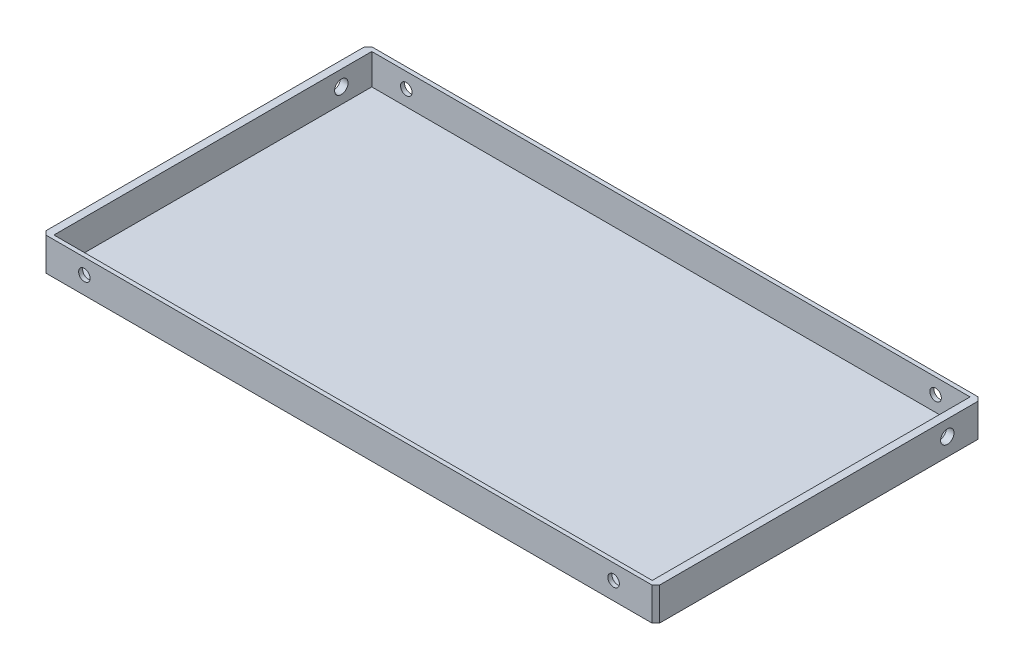
ISO-10303-21;
HEADER;
FILE_DESCRIPTION(('STEP AP214'),'2;1');
FILE_NAME('part.step','',(''),(''),'','','');
FILE_SCHEMA(('AUTOMOTIVE_DESIGN { 1 0 10303 214 1 1 1 1 }'));
ENDSEC;
DATA;
#1=APPLICATION_CONTEXT('core data for automotive mechanical design processes');
#2=APPLICATION_PROTOCOL_DEFINITION('international standard','automotive_design',2000,#1);
#3=PRODUCT_CONTEXT('',#1,'mechanical');
#4=PRODUCT('Part','Part','',(#3));
#5=PRODUCT_RELATED_PRODUCT_CATEGORY('part','',(#4));
#6=PRODUCT_DEFINITION_FORMATION('','',#4);
#7=PRODUCT_DEFINITION_CONTEXT('part definition',#1,'design');
#8=PRODUCT_DEFINITION('design','',#6,#7);
#9=PRODUCT_DEFINITION_SHAPE('','',#8);
#10=(LENGTH_UNIT() NAMED_UNIT(*) SI_UNIT(.MILLI.,.METRE.));
#11=(NAMED_UNIT(*) PLANE_ANGLE_UNIT() SI_UNIT($,.RADIAN.));
#12=(NAMED_UNIT(*) SI_UNIT($,.STERADIAN.) SOLID_ANGLE_UNIT());
#13=UNCERTAINTY_MEASURE_WITH_UNIT(LENGTH_MEASURE(1.E-05),#10,'distance_accuracy_value','');
#14=(GEOMETRIC_REPRESENTATION_CONTEXT(3) GLOBAL_UNCERTAINTY_ASSIGNED_CONTEXT((#13)) GLOBAL_UNIT_ASSIGNED_CONTEXT((#10,
#11,#12)) REPRESENTATION_CONTEXT('',''));
#15=CARTESIAN_POINT('',(0.,0.,0.));
#16=DIRECTION('',(0.,0.,1.));
#17=DIRECTION('',(1.,0.,0.));
#18=AXIS2_PLACEMENT_3D('',#15,#16,#17);
#19=CARTESIAN_POINT('',(80.,0.6,-42.5));
#20=DIRECTION('',(-1.,0.,0.));
#21=DIRECTION('',(0.,0.,1.));
#22=AXIS2_PLACEMENT_3D('',#19,#20,#21);
#23=PLANE('',#22);
#24=CARTESIAN_POINT('',(80.,4.6,-33.5));
#25=DIRECTION('',(1.,0.,0.));
#26=DIRECTION('',(0.,0.,-1.));
#27=AXIS2_PLACEMENT_3D('',#24,#25,#26);
#28=CIRCLE('',#27,1.75);
#29=CARTESIAN_POINT('',(80.,4.6,-35.25));
#30=VERTEX_POINT('',#29);
#31=EDGE_CURVE('E348',#30,#30,#28,.T.);
#32=ORIENTED_EDGE('',*,*,#31,.F.);
#33=EDGE_LOOP('',(#32));
#34=FACE_BOUND('',#33,.T.);
#35=DIRECTION('',(0.,0.,-1.));
#36=VECTOR('',#35,1.);
#37=CARTESIAN_POINT('',(80.,0.,-42.5));
#38=LINE('',#37,#36);
#39=CARTESIAN_POINT('',(80.,0.,41.5));
#40=VERTEX_POINT('',#39);
#41=CARTESIAN_POINT('',(80.,0.,-41.5));
#42=VERTEX_POINT('',#41);
#43=EDGE_CURVE('E178',#40,#42,#38,.T.);
#44=ORIENTED_EDGE('',*,*,#43,.T.);
#45=DIRECTION('',(0.,1.,0.));
#46=VECTOR('',#45,1.);
#47=CARTESIAN_POINT('',(80.,0.6,-41.5));
#48=LINE('',#47,#46);
#49=CARTESIAN_POINT('',(80.,8.6,-41.5));
#50=VERTEX_POINT('',#49);
#51=EDGE_CURVE('E205',#42,#50,#48,.T.);
#52=ORIENTED_EDGE('',*,*,#51,.T.);
#53=DIRECTION('',(0.,0.,-1.));
#54=VECTOR('',#53,1.);
#55=CARTESIAN_POINT('',(80.,8.6,42.5));
#56=LINE('',#55,#54);
#57=CARTESIAN_POINT('',(80.,8.6,41.5));
#58=VERTEX_POINT('',#57);
#59=EDGE_CURVE('E144',#58,#50,#56,.T.);
#60=ORIENTED_EDGE('',*,*,#59,.F.);
#61=DIRECTION('',(0.,-1.,0.));
#62=VECTOR('',#61,1.);
#63=CARTESIAN_POINT('',(80.,0.6,41.5));
#64=LINE('',#63,#62);
#65=EDGE_CURVE('E202',#58,#40,#64,.T.);
#66=ORIENTED_EDGE('',*,*,#65,.T.);
#67=EDGE_LOOP('',(#44,#52,#60,#66));
#68=FACE_BOUND('',#67,.T.);
#69=ADVANCED_FACE('F33',(#34,#68),#23,.F.);
#70=CARTESIAN_POINT('',(-80.,0.6,-42.5));
#71=DIRECTION('',(0.,0.,1.));
#72=DIRECTION('',(1.,0.,0.));
#73=AXIS2_PLACEMENT_3D('',#70,#71,#72);
#74=PLANE('',#73);
#75=CARTESIAN_POINT('',(69.,4.6,-42.5));
#76=DIRECTION('',(0.,0.,1.));
#77=DIRECTION('',(1.,0.,0.));
#78=AXIS2_PLACEMENT_3D('',#75,#76,#77);
#79=CIRCLE('',#78,1.5);
#80=CARTESIAN_POINT('',(70.5,4.6,-42.5));
#81=VERTEX_POINT('',#80);
#82=EDGE_CURVE('E232',#81,#81,#79,.T.);
#83=ORIENTED_EDGE('',*,*,#82,.T.);
#84=EDGE_LOOP('',(#83));
#85=FACE_BOUND('',#84,.T.);
#86=CARTESIAN_POINT('',(-69.0000000000001,4.6,-42.5));
#87=DIRECTION('',(0.,0.,1.));
#88=DIRECTION('',(1.,0.,0.));
#89=AXIS2_PLACEMENT_3D('',#86,#87,#88);
#90=CIRCLE('',#89,1.5);
#91=CARTESIAN_POINT('',(-67.5000000000001,4.6,-42.5));
#92=VERTEX_POINT('',#91);
#93=EDGE_CURVE('E159',#92,#92,#90,.T.);
#94=ORIENTED_EDGE('',*,*,#93,.T.);
#95=EDGE_LOOP('',(#94));
#96=FACE_BOUND('',#95,.T.);
#97=DIRECTION('',(-1.,0.,0.));
#98=VECTOR('',#97,1.);
#99=CARTESIAN_POINT('',(-80.,8.6,-42.5));
#100=LINE('',#99,#98);
#101=CARTESIAN_POINT('',(79.,8.6,-42.5));
#102=VERTEX_POINT('',#101);
#103=CARTESIAN_POINT('',(-79.,8.6,-42.5));
#104=VERTEX_POINT('',#103);
#105=EDGE_CURVE('E171',#102,#104,#100,.T.);
#106=ORIENTED_EDGE('',*,*,#105,.F.);
#107=DIRECTION('',(0.,-1.,0.));
#108=VECTOR('',#107,1.);
#109=CARTESIAN_POINT('',(79.,0.6,-42.5));
#110=LINE('',#109,#108);
#111=CARTESIAN_POINT('',(79.,0.,-42.5));
#112=VERTEX_POINT('',#111);
#113=EDGE_CURVE('E191',#102,#112,#110,.T.);
#114=ORIENTED_EDGE('',*,*,#113,.T.);
#115=DIRECTION('',(-1.,0.,0.));
#116=VECTOR('',#115,1.);
#117=CARTESIAN_POINT('',(-80.,0.,-42.5));
#118=LINE('',#117,#116);
#119=CARTESIAN_POINT('',(-79.,0.,-42.5));
#120=VERTEX_POINT('',#119);
#121=EDGE_CURVE('E181',#112,#120,#118,.T.);
#122=ORIENTED_EDGE('',*,*,#121,.T.);
#123=DIRECTION('',(0.,1.,0.));
#124=VECTOR('',#123,1.);
#125=CARTESIAN_POINT('',(-79.,0.6,-42.5));
#126=LINE('',#125,#124);
#127=EDGE_CURVE('E189',#120,#104,#126,.T.);
#128=ORIENTED_EDGE('',*,*,#127,.T.);
#129=EDGE_LOOP('',(#106,#114,#122,#128));
#130=FACE_BOUND('',#129,.T.);
#131=ADVANCED_FACE('F252',(#85,#96,#130),#74,.F.);
#132=CARTESIAN_POINT('',(-80.,0.6,-42.5));
#133=DIRECTION('',(1.,0.,0.));
#134=DIRECTION('',(0.,0.,-1.));
#135=AXIS2_PLACEMENT_3D('',#132,#133,#134);
#136=PLANE('',#135);
#137=CARTESIAN_POINT('',(-80.0000000000001,4.6,-33.5));
#138=DIRECTION('',(1.,0.,0.));
#139=DIRECTION('',(0.,0.,-1.));
#140=AXIS2_PLACEMENT_3D('',#137,#138,#139);
#141=CIRCLE('',#140,1.75);
#142=CARTESIAN_POINT('',(-80.0000000000001,4.6,-35.25));
#143=VERTEX_POINT('',#142);
#144=EDGE_CURVE('E235',#143,#143,#141,.T.);
#145=ORIENTED_EDGE('',*,*,#144,.T.);
#146=EDGE_LOOP('',(#145));
#147=FACE_BOUND('',#146,.T.);
#148=DIRECTION('',(0.,0.,1.));
#149=VECTOR('',#148,1.);
#150=CARTESIAN_POINT('',(-80.,8.6,42.5));
#151=LINE('',#150,#149);
#152=CARTESIAN_POINT('',(-80.,8.6,-41.5));
#153=VERTEX_POINT('',#152);
#154=CARTESIAN_POINT('',(-80.,8.6,41.5));
#155=VERTEX_POINT('',#154);
#156=EDGE_CURVE('E174',#153,#155,#151,.T.);
#157=ORIENTED_EDGE('',*,*,#156,.F.);
#158=DIRECTION('',(0.,-1.,0.));
#159=VECTOR('',#158,1.);
#160=CARTESIAN_POINT('',(-80.,0.6,-41.5));
#161=LINE('',#160,#159);
#162=CARTESIAN_POINT('',(-80.,0.,-41.5));
#163=VERTEX_POINT('',#162);
#164=EDGE_CURVE('E216',#153,#163,#161,.T.);
#165=ORIENTED_EDGE('',*,*,#164,.T.);
#166=DIRECTION('',(0.,0.,1.));
#167=VECTOR('',#166,1.);
#168=CARTESIAN_POINT('',(-80.,0.,-42.5));
#169=LINE('',#168,#167);
#170=CARTESIAN_POINT('',(-80.,0.,41.5));
#171=VERTEX_POINT('',#170);
#172=EDGE_CURVE('E184',#163,#171,#169,.T.);
#173=ORIENTED_EDGE('',*,*,#172,.T.);
#174=DIRECTION('',(0.,1.,0.));
#175=VECTOR('',#174,1.);
#176=CARTESIAN_POINT('',(-80.,0.6,41.5));
#177=LINE('',#176,#175);
#178=EDGE_CURVE('E214',#171,#155,#177,.T.);
#179=ORIENTED_EDGE('',*,*,#178,.T.);
#180=EDGE_LOOP('',(#157,#165,#173,#179));
#181=FACE_BOUND('',#180,.T.);
#182=ADVANCED_FACE('F275',(#147,#181),#136,.F.);
#183=CARTESIAN_POINT('',(-80.,0.6,42.5));
#184=DIRECTION('',(0.,0.,-1.));
#185=DIRECTION('',(-1.,0.,0.));
#186=AXIS2_PLACEMENT_3D('',#183,#184,#185);
#187=PLANE('',#186);
#188=CARTESIAN_POINT('',(69.,4.6,42.5));
#189=DIRECTION('',(0.,0.,1.));
#190=DIRECTION('',(1.,0.,0.));
#191=AXIS2_PLACEMENT_3D('',#188,#189,#190);
#192=CIRCLE('',#191,1.5);
#193=CARTESIAN_POINT('',(70.5,4.6,42.5));
#194=VERTEX_POINT('',#193);
#195=EDGE_CURVE('E228',#194,#194,#192,.T.);
#196=ORIENTED_EDGE('',*,*,#195,.F.);
#197=EDGE_LOOP('',(#196));
#198=FACE_BOUND('',#197,.T.);
#199=CARTESIAN_POINT('',(-69.0000000000001,4.6,42.5));
#200=DIRECTION('',(0.,0.,1.));
#201=DIRECTION('',(1.,0.,0.));
#202=AXIS2_PLACEMENT_3D('',#199,#200,#201);
#203=CIRCLE('',#202,1.5);
#204=CARTESIAN_POINT('',(-67.5000000000001,4.6,42.5));
#205=VERTEX_POINT('',#204);
#206=EDGE_CURVE('E224',#205,#205,#203,.T.);
#207=ORIENTED_EDGE('',*,*,#206,.F.);
#208=EDGE_LOOP('',(#207));
#209=FACE_BOUND('',#208,.T.);
#210=DIRECTION('',(1.,0.,0.));
#211=VECTOR('',#210,1.);
#212=CARTESIAN_POINT('',(-80.,0.,42.5));
#213=LINE('',#212,#211);
#214=CARTESIAN_POINT('',(-79.0000000000001,0.,42.5));
#215=VERTEX_POINT('',#214);
#216=CARTESIAN_POINT('',(79.,0.,42.5));
#217=VERTEX_POINT('',#216);
#218=EDGE_CURVE('E187',#215,#217,#213,.T.);
#219=ORIENTED_EDGE('',*,*,#218,.T.);
#220=DIRECTION('',(0.,1.,0.));
#221=VECTOR('',#220,1.);
#222=CARTESIAN_POINT('',(79.,0.6,42.5));
#223=LINE('',#222,#221);
#224=CARTESIAN_POINT('',(79.,8.6,42.5));
#225=VERTEX_POINT('',#224);
#226=EDGE_CURVE('E11',#217,#225,#223,.T.);
#227=ORIENTED_EDGE('',*,*,#226,.T.);
#228=DIRECTION('',(1.,0.,0.));
#229=VECTOR('',#228,1.);
#230=CARTESIAN_POINT('',(-80.,8.6,42.5));
#231=LINE('',#230,#229);
#232=CARTESIAN_POINT('',(-79.0000000000001,8.6,42.5));
#233=VERTEX_POINT('',#232);
#234=EDGE_CURVE('E176',#233,#225,#231,.T.);
#235=ORIENTED_EDGE('',*,*,#234,.F.);
#236=DIRECTION('',(0.,-1.,0.));
#237=VECTOR('',#236,1.);
#238=CARTESIAN_POINT('',(-79.0000000000001,0.6,42.5));
#239=LINE('',#238,#237);
#240=EDGE_CURVE('E42',#233,#215,#239,.T.);
#241=ORIENTED_EDGE('',*,*,#240,.T.);
#242=EDGE_LOOP('',(#219,#227,#235,#241));
#243=FACE_BOUND('',#242,.T.);
#244=ADVANCED_FACE('F315',(#198,#209,#243),#187,.F.);
#245=CARTESIAN_POINT('',(0.,0.,0.));
#246=DIRECTION('',(0.,1.,0.));
#247=DIRECTION('',(0.,0.,1.));
#248=AXIS2_PLACEMENT_3D('',#245,#246,#247);
#249=PLANE('',#248);
#250=ORIENTED_EDGE('',*,*,#121,.F.);
#251=DIRECTION('',(-0.707106781186548,0.,-0.707106781186548));
#252=VECTOR('',#251,1.);
#253=CARTESIAN_POINT('',(79.,0.,-42.5));
#254=LINE('',#253,#252);
#255=EDGE_CURVE('E200',#112,#42,#254,.F.);
#256=ORIENTED_EDGE('',*,*,#255,.T.);
#257=ORIENTED_EDGE('',*,*,#43,.F.);
#258=DIRECTION('',(0.707106781186543,0.,-0.707106781186552));
#259=VECTOR('',#258,1.);
#260=CARTESIAN_POINT('',(80.,0.,41.5));
#261=LINE('',#260,#259);
#262=EDGE_CURVE('E196',#40,#217,#261,.F.);
#263=ORIENTED_EDGE('',*,*,#262,.T.);
#264=ORIENTED_EDGE('',*,*,#218,.F.);
#265=DIRECTION('',(0.707106781186548,0.,0.707106781186548));
#266=VECTOR('',#265,1.);
#267=CARTESIAN_POINT('',(-79.0000000000001,0.,42.5));
#268=LINE('',#267,#266);
#269=EDGE_CURVE('E194',#215,#171,#268,.F.);
#270=ORIENTED_EDGE('',*,*,#269,.T.);
#271=ORIENTED_EDGE('',*,*,#172,.F.);
#272=DIRECTION('',(-0.707106781186557,0.,0.707106781186538));
#273=VECTOR('',#272,1.);
#274=CARTESIAN_POINT('',(-80.,0.,-41.5));
#275=LINE('',#274,#273);
#276=EDGE_CURVE('E198',#163,#120,#275,.F.);
#277=ORIENTED_EDGE('',*,*,#276,.T.);
#278=EDGE_LOOP('',(#250,#256,#257,#263,#264,#270,#271,#277));
#279=FACE_BOUND('',#278,.T.);
#280=ADVANCED_FACE('F317',(#279),#249,.F.);
#281=CARTESIAN_POINT('',(0.,8.6,0.));
#282=DIRECTION('',(0.,-1.,0.));
#283=DIRECTION('',(0.,0.,-1.));
#284=AXIS2_PLACEMENT_3D('',#281,#282,#283);
#285=PLANE('',#284);
#286=ORIENTED_EDGE('',*,*,#59,.T.);
#287=DIRECTION('',(0.707106781186548,0.,0.707106781186548));
#288=VECTOR('',#287,1.);
#289=CARTESIAN_POINT('',(79.,8.6,-42.5));
#290=LINE('',#289,#288);
#291=EDGE_CURVE('E212',#50,#102,#290,.F.);
#292=ORIENTED_EDGE('',*,*,#291,.T.);
#293=ORIENTED_EDGE('',*,*,#105,.T.);
#294=DIRECTION('',(0.707106781186557,0.,-0.707106781186538));
#295=VECTOR('',#294,1.);
#296=CARTESIAN_POINT('',(-80.,8.6,-41.5));
#297=LINE('',#296,#295);
#298=EDGE_CURVE('E210',#104,#153,#297,.F.);
#299=ORIENTED_EDGE('',*,*,#298,.T.);
#300=ORIENTED_EDGE('',*,*,#156,.T.);
#301=DIRECTION('',(-0.707106781186548,0.,-0.707106781186548));
#302=VECTOR('',#301,1.);
#303=CARTESIAN_POINT('',(-79.0000000000001,8.6,42.5));
#304=LINE('',#303,#302);
#305=EDGE_CURVE('E55',#155,#233,#304,.F.);
#306=ORIENTED_EDGE('',*,*,#305,.T.);
#307=ORIENTED_EDGE('',*,*,#234,.T.);
#308=DIRECTION('',(-0.707106781186543,0.,0.707106781186552));
#309=VECTOR('',#308,1.);
#310=CARTESIAN_POINT('',(80.,8.6,41.5));
#311=LINE('',#310,#309);
#312=EDGE_CURVE('E208',#225,#58,#311,.F.);
#313=ORIENTED_EDGE('',*,*,#312,.T.);
#314=EDGE_LOOP('',(#286,#292,#293,#299,#300,#306,#307,#313));
#315=FACE_BOUND('',#314,.T.);
#316=DIRECTION('',(0.,0.,-1.));
#317=VECTOR('',#316,1.);
#318=CARTESIAN_POINT('',(78.,8.6,41.4375));
#319=LINE('',#318,#317);
#320=CARTESIAN_POINT('',(78.,8.6,41.4375));
#321=VERTEX_POINT('',#320);
#322=CARTESIAN_POINT('',(78.,8.6,-41.4375));
#323=VERTEX_POINT('',#322);
#324=EDGE_CURVE('E125',#321,#323,#319,.T.);
#325=ORIENTED_EDGE('',*,*,#324,.F.);
#326=DIRECTION('',(1.,0.,0.));
#327=VECTOR('',#326,1.);
#328=CARTESIAN_POINT('',(-78.,8.6,41.4375));
#329=LINE('',#328,#327);
#330=CARTESIAN_POINT('',(-78.,8.6,41.4375));
#331=VERTEX_POINT('',#330);
#332=EDGE_CURVE('E152',#331,#321,#329,.T.);
#333=ORIENTED_EDGE('',*,*,#332,.F.);
#334=DIRECTION('',(0.,0.,1.));
#335=VECTOR('',#334,1.);
#336=CARTESIAN_POINT('',(-78.,8.6,41.4375));
#337=LINE('',#336,#335);
#338=CARTESIAN_POINT('',(-78.,8.6,-41.4375));
#339=VERTEX_POINT('',#338);
#340=EDGE_CURVE('E150',#339,#331,#337,.T.);
#341=ORIENTED_EDGE('',*,*,#340,.F.);
#342=DIRECTION('',(-1.,0.,0.));
#343=VECTOR('',#342,1.);
#344=CARTESIAN_POINT('',(-78.,8.6,-41.4375));
#345=LINE('',#344,#343);
#346=EDGE_CURVE('E135',#323,#339,#345,.T.);
#347=ORIENTED_EDGE('',*,*,#346,.F.);
#348=EDGE_LOOP('',(#325,#333,#341,#347));
#349=FACE_BOUND('',#348,.T.);
#350=ADVANCED_FACE('F148',(#315,#349),#285,.F.);
#351=CARTESIAN_POINT('',(78.,8.6,41.4375));
#352=DIRECTION('',(-1.,0.,0.));
#353=DIRECTION('',(0.,0.,1.));
#354=AXIS2_PLACEMENT_3D('',#351,#352,#353);
#355=PLANE('',#354);
#356=CARTESIAN_POINT('',(78.,4.6,-33.5));
#357=DIRECTION('',(-1.,0.,0.));
#358=DIRECTION('',(0.,0.,1.));
#359=AXIS2_PLACEMENT_3D('',#356,#357,#358);
#360=CIRCLE('',#359,1.75);
#361=CARTESIAN_POINT('',(78.,4.6,-31.75));
#362=VERTEX_POINT('',#361);
#363=EDGE_CURVE('E240',#362,#362,#360,.T.);
#364=ORIENTED_EDGE('',*,*,#363,.F.);
#365=EDGE_LOOP('',(#364));
#366=FACE_BOUND('',#365,.T.);
#367=DIRECTION('',(0.,0.,-1.));
#368=VECTOR('',#367,1.);
#369=CARTESIAN_POINT('',(78.,0.6,41.4375));
#370=LINE('',#369,#368);
#371=CARTESIAN_POINT('',(78.,0.6,41.4375));
#372=VERTEX_POINT('',#371);
#373=CARTESIAN_POINT('',(78.,0.6,-41.4375));
#374=VERTEX_POINT('',#373);
#375=EDGE_CURVE('E157',#372,#374,#370,.T.);
#376=ORIENTED_EDGE('',*,*,#375,.F.);
#377=DIRECTION('',(0.,-1.,0.));
#378=VECTOR('',#377,1.);
#379=CARTESIAN_POINT('',(78.,8.6,41.4375));
#380=LINE('',#379,#378);
#381=EDGE_CURVE('E131',#321,#372,#380,.T.);
#382=ORIENTED_EDGE('',*,*,#381,.F.);
#383=ORIENTED_EDGE('',*,*,#324,.T.);
#384=DIRECTION('',(0.,-1.,0.));
#385=VECTOR('',#384,1.);
#386=CARTESIAN_POINT('',(78.,8.6,-41.4375));
#387=LINE('',#386,#385);
#388=EDGE_CURVE('E129',#323,#374,#387,.T.);
#389=ORIENTED_EDGE('',*,*,#388,.T.);
#390=EDGE_LOOP('',(#376,#382,#383,#389));
#391=FACE_BOUND('',#390,.T.);
#392=ADVANCED_FACE('F128',(#366,#391),#355,.T.);
#393=CARTESIAN_POINT('',(-78.,8.6,-41.4375));
#394=DIRECTION('',(0.,0.,1.));
#395=DIRECTION('',(1.,0.,0.));
#396=AXIS2_PLACEMENT_3D('',#393,#394,#395);
#397=PLANE('',#396);
#398=CARTESIAN_POINT('',(69.,4.6,-41.4375));
#399=DIRECTION('',(0.,0.,1.));
#400=DIRECTION('',(1.,0.,0.));
#401=AXIS2_PLACEMENT_3D('',#398,#399,#400);
#402=CIRCLE('',#401,1.5);
#403=CARTESIAN_POINT('',(70.5,4.6,-41.4375));
#404=VERTEX_POINT('',#403);
#405=EDGE_CURVE('E227',#404,#404,#402,.T.);
#406=ORIENTED_EDGE('',*,*,#405,.F.);
#407=EDGE_LOOP('',(#406));
#408=FACE_BOUND('',#407,.T.);
#409=CARTESIAN_POINT('',(-69.0000000000001,4.6,-41.4375));
#410=DIRECTION('',(0.,0.,1.));
#411=DIRECTION('',(1.,0.,0.));
#412=AXIS2_PLACEMENT_3D('',#409,#410,#411);
#413=CIRCLE('',#412,1.5);
#414=CARTESIAN_POINT('',(-67.5000000000001,4.6,-41.4375));
#415=VERTEX_POINT('',#414);
#416=EDGE_CURVE('E223',#415,#415,#413,.T.);
#417=ORIENTED_EDGE('',*,*,#416,.F.);
#418=EDGE_LOOP('',(#417));
#419=FACE_BOUND('',#418,.T.);
#420=DIRECTION('',(-1.,0.,0.));
#421=VECTOR('',#420,1.);
#422=CARTESIAN_POINT('',(-78.,0.6,-41.4375));
#423=LINE('',#422,#421);
#424=CARTESIAN_POINT('',(-78.,0.6,-41.4375));
#425=VERTEX_POINT('',#424);
#426=EDGE_CURVE('E143',#374,#425,#423,.T.);
#427=ORIENTED_EDGE('',*,*,#426,.F.);
#428=ORIENTED_EDGE('',*,*,#388,.F.);
#429=ORIENTED_EDGE('',*,*,#346,.T.);
#430=DIRECTION('',(0.,-1.,0.));
#431=VECTOR('',#430,1.);
#432=CARTESIAN_POINT('',(-78.,8.6,-41.4375));
#433=LINE('',#432,#431);
#434=EDGE_CURVE('E145',#339,#425,#433,.T.);
#435=ORIENTED_EDGE('',*,*,#434,.T.);
#436=EDGE_LOOP('',(#427,#428,#429,#435));
#437=FACE_BOUND('',#436,.T.);
#438=ADVANCED_FACE('F140',(#408,#419,#437),#397,.T.);
#439=CARTESIAN_POINT('',(-78.,8.6,41.4375));
#440=DIRECTION('',(1.,0.,0.));
#441=DIRECTION('',(0.,0.,-1.));
#442=AXIS2_PLACEMENT_3D('',#439,#440,#441);
#443=PLANE('',#442);
#444=CARTESIAN_POINT('',(-78.,4.6,-33.5));
#445=DIRECTION('',(1.,0.,0.));
#446=DIRECTION('',(0.,0.,-1.));
#447=AXIS2_PLACEMENT_3D('',#444,#445,#446);
#448=CIRCLE('',#447,1.75);
#449=CARTESIAN_POINT('',(-78.,4.6,-35.25));
#450=VERTEX_POINT('',#449);
#451=EDGE_CURVE('E37',#450,#450,#448,.T.);
#452=ORIENTED_EDGE('',*,*,#451,.F.);
#453=EDGE_LOOP('',(#452));
#454=FACE_BOUND('',#453,.T.);
#455=DIRECTION('',(0.,0.,1.));
#456=VECTOR('',#455,1.);
#457=CARTESIAN_POINT('',(-78.,0.6,41.4375));
#458=LINE('',#457,#456);
#459=CARTESIAN_POINT('',(-78.,0.6,41.4375));
#460=VERTEX_POINT('',#459);
#461=EDGE_CURVE('E161',#425,#460,#458,.T.);
#462=ORIENTED_EDGE('',*,*,#461,.F.);
#463=ORIENTED_EDGE('',*,*,#434,.F.);
#464=ORIENTED_EDGE('',*,*,#340,.T.);
#465=DIRECTION('',(0.,-1.,0.));
#466=VECTOR('',#465,1.);
#467=CARTESIAN_POINT('',(-78.,8.6,41.4375));
#468=LINE('',#467,#466);
#469=EDGE_CURVE('E165',#331,#460,#468,.T.);
#470=ORIENTED_EDGE('',*,*,#469,.T.);
#471=EDGE_LOOP('',(#462,#463,#464,#470));
#472=FACE_BOUND('',#471,.T.);
#473=ADVANCED_FACE('F360',(#454,#472),#443,.T.);
#474=CARTESIAN_POINT('',(-78.,8.6,41.4375));
#475=DIRECTION('',(0.,0.,-1.));
#476=DIRECTION('',(-1.,0.,0.));
#477=AXIS2_PLACEMENT_3D('',#474,#475,#476);
#478=PLANE('',#477);
#479=CARTESIAN_POINT('',(69.,4.6,41.4375));
#480=DIRECTION('',(0.,0.,-1.));
#481=DIRECTION('',(-1.,0.,0.));
#482=AXIS2_PLACEMENT_3D('',#479,#480,#481);
#483=CIRCLE('',#482,1.5);
#484=CARTESIAN_POINT('',(67.5,4.6,41.4375));
#485=VERTEX_POINT('',#484);
#486=EDGE_CURVE('E225',#485,#485,#483,.T.);
#487=ORIENTED_EDGE('',*,*,#486,.F.);
#488=EDGE_LOOP('',(#487));
#489=FACE_BOUND('',#488,.T.);
#490=CARTESIAN_POINT('',(-69.0000000000001,4.6,41.4375));
#491=DIRECTION('',(0.,0.,-1.));
#492=DIRECTION('',(-1.,0.,0.));
#493=AXIS2_PLACEMENT_3D('',#490,#491,#492);
#494=CIRCLE('',#493,1.5);
#495=CARTESIAN_POINT('',(-70.5000000000001,4.6,41.4375));
#496=VERTEX_POINT('',#495);
#497=EDGE_CURVE('E221',#496,#496,#494,.T.);
#498=ORIENTED_EDGE('',*,*,#497,.F.);
#499=EDGE_LOOP('',(#498));
#500=FACE_BOUND('',#499,.T.);
#501=DIRECTION('',(1.,0.,0.));
#502=VECTOR('',#501,1.);
#503=CARTESIAN_POINT('',(-78.,0.6,41.4375));
#504=LINE('',#503,#502);
#505=EDGE_CURVE('E136',#460,#372,#504,.T.);
#506=ORIENTED_EDGE('',*,*,#505,.F.);
#507=ORIENTED_EDGE('',*,*,#469,.F.);
#508=ORIENTED_EDGE('',*,*,#332,.T.);
#509=ORIENTED_EDGE('',*,*,#381,.T.);
#510=EDGE_LOOP('',(#506,#507,#508,#509));
#511=FACE_BOUND('',#510,.T.);
#512=ADVANCED_FACE('F365',(#489,#500,#511),#478,.T.);
#513=CARTESIAN_POINT('',(0.,0.6,0.));
#514=DIRECTION('',(0.,1.,0.));
#515=DIRECTION('',(0.,0.,1.));
#516=AXIS2_PLACEMENT_3D('',#513,#514,#515);
#517=PLANE('',#516);
#518=ORIENTED_EDGE('',*,*,#375,.T.);
#519=ORIENTED_EDGE('',*,*,#426,.T.);
#520=ORIENTED_EDGE('',*,*,#461,.T.);
#521=ORIENTED_EDGE('',*,*,#505,.T.);
#522=EDGE_LOOP('',(#518,#519,#520,#521));
#523=FACE_BOUND('',#522,.T.);
#524=ADVANCED_FACE('F286',(#523),#517,.T.);
#525=CARTESIAN_POINT('',(79.,0.6,-42.5));
#526=DIRECTION('',(-0.707106781186547,0.,0.707106781186547));
#527=DIRECTION('',(0.,-1.,0.));
#528=AXIS2_PLACEMENT_3D('',#525,#526,#527);
#529=PLANE('',#528);
#530=ORIENTED_EDGE('',*,*,#291,.F.);
#531=ORIENTED_EDGE('',*,*,#51,.F.);
#532=ORIENTED_EDGE('',*,*,#255,.F.);
#533=ORIENTED_EDGE('',*,*,#113,.F.);
#534=EDGE_LOOP('',(#530,#531,#532,#533));
#535=FACE_BOUND('',#534,.T.);
#536=ADVANCED_FACE('F282',(#535),#529,.F.);
#537=CARTESIAN_POINT('',(-80.,0.6,-41.5));
#538=DIRECTION('',(0.707106781186538,0.,0.707106781186557));
#539=DIRECTION('',(0.,-1.,0.));
#540=AXIS2_PLACEMENT_3D('',#537,#538,#539);
#541=PLANE('',#540);
#542=ORIENTED_EDGE('',*,*,#298,.F.);
#543=ORIENTED_EDGE('',*,*,#127,.F.);
#544=ORIENTED_EDGE('',*,*,#276,.F.);
#545=ORIENTED_EDGE('',*,*,#164,.F.);
#546=EDGE_LOOP('',(#542,#543,#544,#545));
#547=FACE_BOUND('',#546,.T.);
#548=ADVANCED_FACE('F285',(#547),#541,.F.);
#549=CARTESIAN_POINT('',(80.,0.6,41.5));
#550=DIRECTION('',(-0.707106781186552,0.,-0.707106781186543));
#551=DIRECTION('',(0.,-1.,0.));
#552=AXIS2_PLACEMENT_3D('',#549,#550,#551);
#553=PLANE('',#552);
#554=ORIENTED_EDGE('',*,*,#312,.F.);
#555=ORIENTED_EDGE('',*,*,#226,.F.);
#556=ORIENTED_EDGE('',*,*,#262,.F.);
#557=ORIENTED_EDGE('',*,*,#65,.F.);
#558=EDGE_LOOP('',(#554,#555,#556,#557));
#559=FACE_BOUND('',#558,.T.);
#560=ADVANCED_FACE('F289',(#559),#553,.F.);
#561=CARTESIAN_POINT('',(-79.0000000000001,0.6,42.5));
#562=DIRECTION('',(0.707106781186548,0.,-0.707106781186548));
#563=DIRECTION('',(0.,-1.,0.));
#564=AXIS2_PLACEMENT_3D('',#561,#562,#563);
#565=PLANE('',#564);
#566=ORIENTED_EDGE('',*,*,#305,.F.);
#567=ORIENTED_EDGE('',*,*,#178,.F.);
#568=ORIENTED_EDGE('',*,*,#269,.F.);
#569=ORIENTED_EDGE('',*,*,#240,.F.);
#570=EDGE_LOOP('',(#566,#567,#568,#569));
#571=FACE_BOUND('',#570,.T.);
#572=ADVANCED_FACE('F35',(#571),#565,.F.);
#573=CARTESIAN_POINT('',(-69.0000000000001,4.6,-55.5));
#574=DIRECTION('',(0.,0.,1.));
#575=DIRECTION('',(1.,0.,0.));
#576=AXIS2_PLACEMENT_3D('',#573,#574,#575);
#577=CYLINDRICAL_SURFACE('',#576,1.5);
#578=ORIENTED_EDGE('',*,*,#497,.T.);
#579=EDGE_LOOP('',(#578));
#580=FACE_BOUND('',#579,.T.);
#581=ORIENTED_EDGE('',*,*,#206,.T.);
#582=EDGE_LOOP('',(#581));
#583=FACE_BOUND('',#582,.T.);
#584=ADVANCED_FACE('F258',(#580,#583),#577,.F.);
#585=ORIENTED_EDGE('',*,*,#416,.T.);
#586=EDGE_LOOP('',(#585));
#587=FACE_BOUND('',#586,.T.);
#588=ORIENTED_EDGE('',*,*,#93,.F.);
#589=EDGE_LOOP('',(#588));
#590=FACE_BOUND('',#589,.T.);
#591=ADVANCED_FACE('F255',(#587,#590),#577,.F.);
#592=CARTESIAN_POINT('',(69.,4.6,-55.5));
#593=DIRECTION('',(0.,0.,1.));
#594=DIRECTION('',(1.,0.,0.));
#595=AXIS2_PLACEMENT_3D('',#592,#593,#594);
#596=CYLINDRICAL_SURFACE('',#595,1.5);
#597=ORIENTED_EDGE('',*,*,#486,.T.);
#598=EDGE_LOOP('',(#597));
#599=FACE_BOUND('',#598,.T.);
#600=ORIENTED_EDGE('',*,*,#195,.T.);
#601=EDGE_LOOP('',(#600));
#602=FACE_BOUND('',#601,.T.);
#603=ADVANCED_FACE('F257',(#599,#602),#596,.F.);
#604=ORIENTED_EDGE('',*,*,#405,.T.);
#605=EDGE_LOOP('',(#604));
#606=FACE_BOUND('',#605,.T.);
#607=ORIENTED_EDGE('',*,*,#82,.F.);
#608=EDGE_LOOP('',(#607));
#609=FACE_BOUND('',#608,.T.);
#610=ADVANCED_FACE('F265',(#606,#609),#596,.F.);
#611=CARTESIAN_POINT('',(-920.,4.6,-33.5));
#612=DIRECTION('',(1.,0.,0.));
#613=DIRECTION('',(0.,0.,-1.));
#614=AXIS2_PLACEMENT_3D('',#611,#612,#613);
#615=CYLINDRICAL_SURFACE('',#614,1.75);
#616=ORIENTED_EDGE('',*,*,#451,.T.);
#617=EDGE_LOOP('',(#616));
#618=FACE_BOUND('',#617,.T.);
#619=ORIENTED_EDGE('',*,*,#144,.F.);
#620=EDGE_LOOP('',(#619));
#621=FACE_BOUND('',#620,.T.);
#622=ADVANCED_FACE('F334',(#618,#621),#615,.F.);
#623=ORIENTED_EDGE('',*,*,#363,.T.);
#624=EDGE_LOOP('',(#623));
#625=FACE_BOUND('',#624,.T.);
#626=ORIENTED_EDGE('',*,*,#31,.T.);
#627=EDGE_LOOP('',(#626));
#628=FACE_BOUND('',#627,.T.);
#629=ADVANCED_FACE('F336',(#625,#628),#615,.F.);
#630=CLOSED_SHELL('',(#69,#131,#182,#244,#280,#350,#392,#438,#473,#512,#524,#536,#548,#560,#572,
#584,#591,#603,#610,#622,#629));
#631=MANIFOLD_SOLID_BREP('B2',#630);
#632=ADVANCED_BREP_SHAPE_REPRESENTATION('',(#18,#631),#14);
#633=SHAPE_DEFINITION_REPRESENTATION(#9,#632);
ENDSEC;
END-ISO-10303-21;
